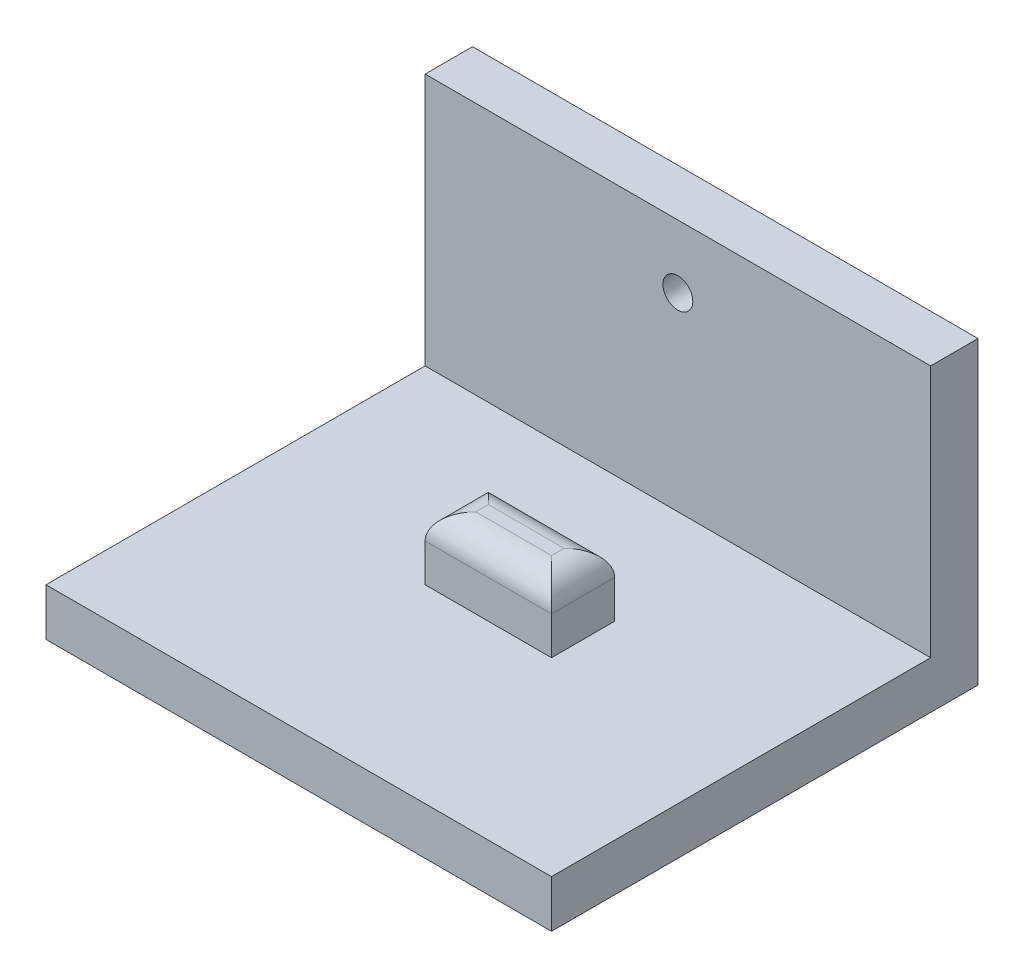
ISO-10303-21;
HEADER;
FILE_DESCRIPTION(('STEP AP214'),'2;1');
FILE_NAME('part.step','',(''),(''),'','','');
FILE_SCHEMA(('AUTOMOTIVE_DESIGN { 1 0 10303 214 1 1 1 1 }'));
ENDSEC;
DATA;
#1=APPLICATION_CONTEXT('core data for automotive mechanical design processes');
#2=APPLICATION_PROTOCOL_DEFINITION('international standard','automotive_design',2000,#1);
#3=PRODUCT_CONTEXT('',#1,'mechanical');
#4=PRODUCT('Part','Part','',(#3));
#5=PRODUCT_RELATED_PRODUCT_CATEGORY('part','',(#4));
#6=PRODUCT_DEFINITION_FORMATION('','',#4);
#7=PRODUCT_DEFINITION_CONTEXT('part definition',#1,'design');
#8=PRODUCT_DEFINITION('design','',#6,#7);
#9=PRODUCT_DEFINITION_SHAPE('','',#8);
#10=(LENGTH_UNIT() NAMED_UNIT(*) SI_UNIT(.MILLI.,.METRE.));
#11=(NAMED_UNIT(*) PLANE_ANGLE_UNIT() SI_UNIT($,.RADIAN.));
#12=(NAMED_UNIT(*) SI_UNIT($,.STERADIAN.) SOLID_ANGLE_UNIT());
#13=UNCERTAINTY_MEASURE_WITH_UNIT(LENGTH_MEASURE(1.E-05),#10,'distance_accuracy_value','');
#14=(GEOMETRIC_REPRESENTATION_CONTEXT(3) GLOBAL_UNCERTAINTY_ASSIGNED_CONTEXT((#13)) GLOBAL_UNIT_ASSIGNED_CONTEXT((#10,
#11,#12)) REPRESENTATION_CONTEXT('',''));
#15=CARTESIAN_POINT('',(0.,0.,0.));
#16=DIRECTION('',(0.,0.,1.));
#17=DIRECTION('',(1.,0.,0.));
#18=AXIS2_PLACEMENT_3D('',#15,#16,#17);
#19=CARTESIAN_POINT('',(50.8,4.7625,42.8625));
#20=DIRECTION('',(0.,-1.,0.));
#21=DIRECTION('',(0.,0.,-1.));
#22=AXIS2_PLACEMENT_3D('',#19,#20,#21);
#23=PLANE('',#22);
#24=DIRECTION('',(0.,0.,1.));
#25=VECTOR('',#24,1.);
#26=CARTESIAN_POINT('',(0.,4.7625,42.8625));
#27=LINE('',#26,#25);
#28=CARTESIAN_POINT('',(0.,4.7625,4.7625));
#29=VERTEX_POINT('',#28);
#30=CARTESIAN_POINT('',(0.,4.7625,42.8625));
#31=VERTEX_POINT('',#30);
#32=EDGE_CURVE('E200',#29,#31,#27,.T.);
#33=ORIENTED_EDGE('',*,*,#32,.T.);
#34=DIRECTION('',(-1.,0.,0.));
#35=VECTOR('',#34,1.);
#36=CARTESIAN_POINT('',(50.8,4.7625,42.8625));
#37=LINE('',#36,#35);
#38=CARTESIAN_POINT('',(50.8,4.7625,42.8625));
#39=VERTEX_POINT('',#38);
#40=EDGE_CURVE('E215',#39,#31,#37,.T.);
#41=ORIENTED_EDGE('',*,*,#40,.F.);
#42=DIRECTION('',(0.,0.,1.));
#43=VECTOR('',#42,1.);
#44=CARTESIAN_POINT('',(50.8,4.7625,42.8625));
#45=LINE('',#44,#43);
#46=CARTESIAN_POINT('',(50.8,4.7625,4.7625));
#47=VERTEX_POINT('',#46);
#48=EDGE_CURVE('E181',#47,#39,#45,.T.);
#49=ORIENTED_EDGE('',*,*,#48,.F.);
#50=DIRECTION('',(-1.,0.,0.));
#51=VECTOR('',#50,1.);
#52=CARTESIAN_POINT('',(50.8,4.7625,4.7625));
#53=LINE('',#52,#51);
#54=EDGE_CURVE('E219',#47,#29,#53,.T.);
#55=ORIENTED_EDGE('',*,*,#54,.T.);
#56=EDGE_LOOP('',(#33,#41,#49,#55));
#57=FACE_BOUND('',#56,.T.);
#58=DIRECTION('',(0.,0.,1.));
#59=VECTOR('',#58,1.);
#60=CARTESIAN_POINT('',(19.05,4.7625,23.8125));
#61=LINE('',#60,#59);
#62=CARTESIAN_POINT('',(19.05,4.7625,17.4625));
#63=VERTEX_POINT('',#62);
#64=CARTESIAN_POINT('',(19.05,4.7625,23.8125));
#65=VERTEX_POINT('',#64);
#66=EDGE_CURVE('E133',#63,#65,#61,.T.);
#67=ORIENTED_EDGE('',*,*,#66,.F.);
#68=DIRECTION('',(-1.,0.,0.));
#69=VECTOR('',#68,1.);
#70=CARTESIAN_POINT('',(19.05,4.7625,17.4625));
#71=LINE('',#70,#69);
#72=CARTESIAN_POINT('',(31.75,4.7625,17.4625));
#73=VERTEX_POINT('',#72);
#74=EDGE_CURVE('E141',#73,#63,#71,.T.);
#75=ORIENTED_EDGE('',*,*,#74,.F.);
#76=DIRECTION('',(0.,0.,-1.));
#77=VECTOR('',#76,1.);
#78=CARTESIAN_POINT('',(31.75,4.7625,23.8125));
#79=LINE('',#78,#77);
#80=CARTESIAN_POINT('',(31.75,4.7625,23.8125));
#81=VERTEX_POINT('',#80);
#82=EDGE_CURVE('E155',#81,#73,#79,.T.);
#83=ORIENTED_EDGE('',*,*,#82,.F.);
#84=DIRECTION('',(1.,0.,0.));
#85=VECTOR('',#84,1.);
#86=CARTESIAN_POINT('',(19.05,4.7625,23.8125));
#87=LINE('',#86,#85);
#88=EDGE_CURVE('E149',#65,#81,#87,.T.);
#89=ORIENTED_EDGE('',*,*,#88,.F.);
#90=EDGE_LOOP('',(#67,#75,#83,#89));
#91=FACE_BOUND('',#90,.T.);
#92=ADVANCED_FACE('F39',(#57,#91),#23,.F.);
#93=CARTESIAN_POINT('',(50.8,30.1625,0.));
#94=DIRECTION('',(0.,0.,1.));
#95=DIRECTION('',(0.,-1.,0.));
#96=AXIS2_PLACEMENT_3D('',#93,#94,#95);
#97=PLANE('',#96);
#98=CARTESIAN_POINT('',(25.4,23.8125,0.));
#99=DIRECTION('',(0.,0.,1.));
#100=DIRECTION('',(1.,0.,0.));
#101=AXIS2_PLACEMENT_3D('',#98,#99,#100);
#102=CIRCLE('',#101,1.499997);
#103=CARTESIAN_POINT('',(26.899997,23.8125,0.));
#104=VERTEX_POINT('',#103);
#105=EDGE_CURVE('E151',#104,#104,#102,.T.);
#106=ORIENTED_EDGE('',*,*,#105,.T.);
#107=EDGE_LOOP('',(#106));
#108=FACE_BOUND('',#107,.T.);
#109=DIRECTION('',(0.,1.,0.));
#110=VECTOR('',#109,1.);
#111=CARTESIAN_POINT('',(0.,30.1625,0.));
#112=LINE('',#111,#110);
#113=CARTESIAN_POINT('',(0.,0.,0.));
#114=VERTEX_POINT('',#113);
#115=CARTESIAN_POINT('',(0.,30.1625,0.));
#116=VERTEX_POINT('',#115);
#117=EDGE_CURVE('E169',#114,#116,#112,.T.);
#118=ORIENTED_EDGE('',*,*,#117,.T.);
#119=DIRECTION('',(-1.,0.,0.));
#120=VECTOR('',#119,1.);
#121=CARTESIAN_POINT('',(50.8,30.1625,0.));
#122=LINE('',#121,#120);
#123=CARTESIAN_POINT('',(50.8,30.1625,0.));
#124=VERTEX_POINT('',#123);
#125=EDGE_CURVE('E227',#124,#116,#122,.T.);
#126=ORIENTED_EDGE('',*,*,#125,.F.);
#127=DIRECTION('',(0.,1.,0.));
#128=VECTOR('',#127,1.);
#129=CARTESIAN_POINT('',(50.8,30.1625,0.));
#130=LINE('',#129,#128);
#131=CARTESIAN_POINT('',(50.8,0.,0.));
#132=VERTEX_POINT('',#131);
#133=EDGE_CURVE('E170',#132,#124,#130,.T.);
#134=ORIENTED_EDGE('',*,*,#133,.F.);
#135=DIRECTION('',(-1.,0.,0.));
#136=VECTOR('',#135,1.);
#137=CARTESIAN_POINT('',(50.8,0.,0.));
#138=LINE('',#137,#136);
#139=EDGE_CURVE('E190',#132,#114,#138,.T.);
#140=ORIENTED_EDGE('',*,*,#139,.T.);
#141=EDGE_LOOP('',(#118,#126,#134,#140));
#142=FACE_BOUND('',#141,.T.);
#143=ADVANCED_FACE('F297',(#108,#142),#97,.F.);
#144=CARTESIAN_POINT('',(50.8,30.1625,4.7625));
#145=DIRECTION('',(0.,-1.,0.));
#146=DIRECTION('',(0.,0.,-1.));
#147=AXIS2_PLACEMENT_3D('',#144,#145,#146);
#148=PLANE('',#147);
#149=DIRECTION('',(0.,0.,1.));
#150=VECTOR('',#149,1.);
#151=CARTESIAN_POINT('',(0.,30.1625,4.7625));
#152=LINE('',#151,#150);
#153=CARTESIAN_POINT('',(0.,30.1625,4.7625));
#154=VERTEX_POINT('',#153);
#155=EDGE_CURVE('E194',#116,#154,#152,.T.);
#156=ORIENTED_EDGE('',*,*,#155,.T.);
#157=DIRECTION('',(-1.,0.,0.));
#158=VECTOR('',#157,1.);
#159=CARTESIAN_POINT('',(50.8,30.1625,4.7625));
#160=LINE('',#159,#158);
#161=CARTESIAN_POINT('',(50.8,30.1625,4.7625));
#162=VERTEX_POINT('',#161);
#163=EDGE_CURVE('E223',#162,#154,#160,.T.);
#164=ORIENTED_EDGE('',*,*,#163,.F.);
#165=DIRECTION('',(0.,0.,1.));
#166=VECTOR('',#165,1.);
#167=CARTESIAN_POINT('',(50.8,30.1625,4.7625));
#168=LINE('',#167,#166);
#169=EDGE_CURVE('E174',#124,#162,#168,.T.);
#170=ORIENTED_EDGE('',*,*,#169,.F.);
#171=ORIENTED_EDGE('',*,*,#125,.T.);
#172=EDGE_LOOP('',(#156,#164,#170,#171));
#173=FACE_BOUND('',#172,.T.);
#174=ADVANCED_FACE('F303',(#173),#148,.F.);
#175=CARTESIAN_POINT('',(50.8,4.7625,4.7625));
#176=DIRECTION('',(0.,0.,-1.));
#177=DIRECTION('',(0.,1.,0.));
#178=AXIS2_PLACEMENT_3D('',#175,#176,#177);
#179=PLANE('',#178);
#180=CARTESIAN_POINT('',(25.4,23.8125,4.7625));
#181=DIRECTION('',(0.,0.,1.));
#182=DIRECTION('',(1.,0.,0.));
#183=AXIS2_PLACEMENT_3D('',#180,#181,#182);
#184=CIRCLE('',#183,1.499997);
#185=CARTESIAN_POINT('',(26.899997,23.8125,4.7625));
#186=VERTEX_POINT('',#185);
#187=EDGE_CURVE('E264',#186,#186,#184,.T.);
#188=ORIENTED_EDGE('',*,*,#187,.F.);
#189=EDGE_LOOP('',(#188));
#190=FACE_BOUND('',#189,.T.);
#191=DIRECTION('',(0.,-1.,0.));
#192=VECTOR('',#191,1.);
#193=CARTESIAN_POINT('',(0.,4.7625,4.7625));
#194=LINE('',#193,#192);
#195=EDGE_CURVE('E197',#154,#29,#194,.T.);
#196=ORIENTED_EDGE('',*,*,#195,.T.);
#197=ORIENTED_EDGE('',*,*,#54,.F.);
#198=DIRECTION('',(0.,-1.,0.));
#199=VECTOR('',#198,1.);
#200=CARTESIAN_POINT('',(50.8,4.7625,4.7625));
#201=LINE('',#200,#199);
#202=EDGE_CURVE('E178',#162,#47,#201,.T.);
#203=ORIENTED_EDGE('',*,*,#202,.F.);
#204=ORIENTED_EDGE('',*,*,#163,.T.);
#205=EDGE_LOOP('',(#196,#197,#203,#204));
#206=FACE_BOUND('',#205,.T.);
#207=ADVANCED_FACE('F310',(#190,#206),#179,.F.);
#208=CARTESIAN_POINT('',(50.8,0.,42.8625));
#209=DIRECTION('',(0.,0.,-1.));
#210=DIRECTION('',(-1.,0.,0.));
#211=AXIS2_PLACEMENT_3D('',#208,#209,#210);
#212=PLANE('',#211);
#213=DIRECTION('',(0.,-1.,0.));
#214=VECTOR('',#213,1.);
#215=CARTESIAN_POINT('',(0.,0.,42.8625));
#216=LINE('',#215,#214);
#217=CARTESIAN_POINT('',(0.,0.,42.8625));
#218=VERTEX_POINT('',#217);
#219=EDGE_CURVE('E203',#31,#218,#216,.T.);
#220=ORIENTED_EDGE('',*,*,#219,.T.);
#221=DIRECTION('',(-1.,0.,0.));
#222=VECTOR('',#221,1.);
#223=CARTESIAN_POINT('',(50.8,0.,42.8625));
#224=LINE('',#223,#222);
#225=CARTESIAN_POINT('',(50.8,0.,42.8625));
#226=VERTEX_POINT('',#225);
#227=EDGE_CURVE('E211',#226,#218,#224,.T.);
#228=ORIENTED_EDGE('',*,*,#227,.F.);
#229=DIRECTION('',(0.,-1.,0.));
#230=VECTOR('',#229,1.);
#231=CARTESIAN_POINT('',(50.8,0.,42.8625));
#232=LINE('',#231,#230);
#233=EDGE_CURVE('E184',#39,#226,#232,.T.);
#234=ORIENTED_EDGE('',*,*,#233,.F.);
#235=ORIENTED_EDGE('',*,*,#40,.T.);
#236=EDGE_LOOP('',(#220,#228,#234,#235));
#237=FACE_BOUND('',#236,.T.);
#238=ADVANCED_FACE('F308',(#237),#212,.F.);
#239=CARTESIAN_POINT('',(50.8,0.,0.));
#240=DIRECTION('',(0.,1.,0.));
#241=DIRECTION('',(0.,0.,1.));
#242=AXIS2_PLACEMENT_3D('',#239,#240,#241);
#243=PLANE('',#242);
#244=DIRECTION('',(0.,0.,-1.));
#245=VECTOR('',#244,1.);
#246=CARTESIAN_POINT('',(0.,0.,0.));
#247=LINE('',#246,#245);
#248=EDGE_CURVE('E175',#218,#114,#247,.T.);
#249=ORIENTED_EDGE('',*,*,#248,.T.);
#250=ORIENTED_EDGE('',*,*,#139,.F.);
#251=DIRECTION('',(0.,0.,-1.));
#252=VECTOR('',#251,1.);
#253=CARTESIAN_POINT('',(50.8,0.,0.));
#254=LINE('',#253,#252);
#255=EDGE_CURVE('E187',#226,#132,#254,.T.);
#256=ORIENTED_EDGE('',*,*,#255,.F.);
#257=ORIENTED_EDGE('',*,*,#227,.T.);
#258=EDGE_LOOP('',(#249,#250,#256,#257));
#259=FACE_BOUND('',#258,.T.);
#260=ADVANCED_FACE('F356',(#259),#243,.F.);
#261=CARTESIAN_POINT('',(50.8,0.,0.));
#262=DIRECTION('',(-1.,0.,0.));
#263=DIRECTION('',(0.,0.,1.));
#264=AXIS2_PLACEMENT_3D('',#261,#262,#263);
#265=PLANE('',#264);
#266=ORIENTED_EDGE('',*,*,#133,.T.);
#267=ORIENTED_EDGE('',*,*,#169,.T.);
#268=ORIENTED_EDGE('',*,*,#202,.T.);
#269=ORIENTED_EDGE('',*,*,#48,.T.);
#270=ORIENTED_EDGE('',*,*,#233,.T.);
#271=ORIENTED_EDGE('',*,*,#255,.T.);
#272=EDGE_LOOP('',(#266,#267,#268,#269,#270,#271));
#273=FACE_BOUND('',#272,.T.);
#274=ADVANCED_FACE('F351',(#273),#265,.F.);
#275=CARTESIAN_POINT('',(0.,0.,0.));
#276=DIRECTION('',(-1.,0.,0.));
#277=DIRECTION('',(0.,0.,1.));
#278=AXIS2_PLACEMENT_3D('',#275,#276,#277);
#279=PLANE('',#278);
#280=ORIENTED_EDGE('',*,*,#117,.F.);
#281=ORIENTED_EDGE('',*,*,#248,.F.);
#282=ORIENTED_EDGE('',*,*,#219,.F.);
#283=ORIENTED_EDGE('',*,*,#32,.F.);
#284=ORIENTED_EDGE('',*,*,#195,.F.);
#285=ORIENTED_EDGE('',*,*,#155,.F.);
#286=EDGE_LOOP('',(#280,#281,#282,#283,#284,#285));
#287=FACE_BOUND('',#286,.T.);
#288=ADVANCED_FACE('F344',(#287),#279,.T.);
#289=CARTESIAN_POINT('',(19.05,11.1125,23.8125));
#290=DIRECTION('',(1.,0.,0.));
#291=DIRECTION('',(0.,0.,-1.));
#292=AXIS2_PLACEMENT_3D('',#289,#290,#291);
#293=PLANE('',#292);
#294=DIRECTION('',(0.,-1.,0.));
#295=VECTOR('',#294,1.);
#296=CARTESIAN_POINT('',(19.05,11.1125,23.8125));
#297=LINE('',#296,#295);
#298=CARTESIAN_POINT('',(19.05,8.5725,23.8125));
#299=VERTEX_POINT('',#298);
#300=EDGE_CURVE('E166',#299,#65,#297,.T.);
#301=ORIENTED_EDGE('',*,*,#300,.F.);
#302=DIRECTION('',(0.,0.,1.));
#303=VECTOR('',#302,1.);
#304=CARTESIAN_POINT('',(19.05,8.5725,23.8125));
#305=LINE('',#304,#303);
#306=CARTESIAN_POINT('',(19.05,8.5725,17.4625));
#307=VERTEX_POINT('',#306);
#308=EDGE_CURVE('E11',#299,#307,#305,.F.);
#309=ORIENTED_EDGE('',*,*,#308,.T.);
#310=DIRECTION('',(0.,-1.,0.));
#311=VECTOR('',#310,1.);
#312=CARTESIAN_POINT('',(19.05,11.1125,17.4625));
#313=LINE('',#312,#311);
#314=EDGE_CURVE('E130',#307,#63,#313,.T.);
#315=ORIENTED_EDGE('',*,*,#314,.T.);
#316=ORIENTED_EDGE('',*,*,#66,.T.);
#317=EDGE_LOOP('',(#301,#309,#315,#316));
#318=FACE_BOUND('',#317,.T.);
#319=ADVANCED_FACE('F132',(#318),#293,.F.);
#320=CARTESIAN_POINT('',(19.05,11.1125,23.8125));
#321=DIRECTION('',(0.,0.,-1.));
#322=DIRECTION('',(0.,1.,0.));
#323=AXIS2_PLACEMENT_3D('',#320,#321,#322);
#324=PLANE('',#323);
#325=DIRECTION('',(0.,-1.,0.));
#326=VECTOR('',#325,1.);
#327=CARTESIAN_POINT('',(31.75,11.1125,23.8125));
#328=LINE('',#327,#326);
#329=CARTESIAN_POINT('',(31.75,8.5725,23.8125));
#330=VERTEX_POINT('',#329);
#331=EDGE_CURVE('E163',#330,#81,#328,.T.);
#332=ORIENTED_EDGE('',*,*,#331,.F.);
#333=DIRECTION('',(1.,0.,0.));
#334=VECTOR('',#333,1.);
#335=CARTESIAN_POINT('',(19.05,8.5725,23.8125));
#336=LINE('',#335,#334);
#337=EDGE_CURVE('E49',#330,#299,#336,.F.);
#338=ORIENTED_EDGE('',*,*,#337,.T.);
#339=ORIENTED_EDGE('',*,*,#300,.T.);
#340=ORIENTED_EDGE('',*,*,#88,.T.);
#341=EDGE_LOOP('',(#332,#338,#339,#340));
#342=FACE_BOUND('',#341,.T.);
#343=ADVANCED_FACE('F277',(#342),#324,.F.);
#344=CARTESIAN_POINT('',(31.75,11.1125,23.8125));
#345=DIRECTION('',(-1.,0.,0.));
#346=DIRECTION('',(0.,0.,1.));
#347=AXIS2_PLACEMENT_3D('',#344,#345,#346);
#348=PLANE('',#347);
#349=DIRECTION('',(0.,-1.,0.));
#350=VECTOR('',#349,1.);
#351=CARTESIAN_POINT('',(31.75,11.1125,17.4625));
#352=LINE('',#351,#350);
#353=CARTESIAN_POINT('',(31.75,8.5725,17.4625));
#354=VERTEX_POINT('',#353);
#355=EDGE_CURVE('E140',#354,#73,#352,.T.);
#356=ORIENTED_EDGE('',*,*,#355,.F.);
#357=DIRECTION('',(0.,0.,-1.));
#358=VECTOR('',#357,1.);
#359=CARTESIAN_POINT('',(31.75,8.5725,23.8125));
#360=LINE('',#359,#358);
#361=EDGE_CURVE('E64',#354,#330,#360,.F.);
#362=ORIENTED_EDGE('',*,*,#361,.T.);
#363=ORIENTED_EDGE('',*,*,#331,.T.);
#364=ORIENTED_EDGE('',*,*,#82,.T.);
#365=EDGE_LOOP('',(#356,#362,#363,#364));
#366=FACE_BOUND('',#365,.T.);
#367=ADVANCED_FACE('F286',(#366),#348,.F.);
#368=CARTESIAN_POINT('',(19.05,11.1125,17.4625));
#369=DIRECTION('',(0.,0.,1.));
#370=DIRECTION('',(0.,-1.,0.));
#371=AXIS2_PLACEMENT_3D('',#368,#369,#370);
#372=PLANE('',#371);
#373=ORIENTED_EDGE('',*,*,#314,.F.);
#374=DIRECTION('',(-1.,0.,0.));
#375=VECTOR('',#374,1.);
#376=CARTESIAN_POINT('',(19.05,8.5725,17.4625));
#377=LINE('',#376,#375);
#378=EDGE_CURVE('E244',#307,#354,#377,.F.);
#379=ORIENTED_EDGE('',*,*,#378,.T.);
#380=ORIENTED_EDGE('',*,*,#355,.T.);
#381=ORIENTED_EDGE('',*,*,#74,.T.);
#382=EDGE_LOOP('',(#373,#379,#380,#381));
#383=FACE_BOUND('',#382,.T.);
#384=ADVANCED_FACE('F153',(#383),#372,.F.);
#385=CARTESIAN_POINT('',(0.,11.1125,0.));
#386=DIRECTION('',(0.,-1.,0.));
#387=DIRECTION('',(0.,0.,-1.));
#388=AXIS2_PLACEMENT_3D('',#385,#386,#387);
#389=PLANE('',#388);
#390=DIRECTION('',(0.,0.,-1.));
#391=VECTOR('',#390,1.);
#392=CARTESIAN_POINT('',(29.21,11.1125,0.));
#393=LINE('',#392,#391);
#394=CARTESIAN_POINT('',(29.21,11.1125,21.2725));
#395=VERTEX_POINT('',#394);
#396=CARTESIAN_POINT('',(29.21,11.1125,20.0025));
#397=VERTEX_POINT('',#396);
#398=EDGE_CURVE('E237',#395,#397,#393,.T.);
#399=ORIENTED_EDGE('',*,*,#398,.T.);
#400=DIRECTION('',(-1.,0.,0.));
#401=VECTOR('',#400,1.);
#402=CARTESIAN_POINT('',(0.,11.1125,20.0025));
#403=LINE('',#402,#401);
#404=CARTESIAN_POINT('',(21.59,11.1125,20.0025));
#405=VERTEX_POINT('',#404);
#406=EDGE_CURVE('E240',#397,#405,#403,.T.);
#407=ORIENTED_EDGE('',*,*,#406,.T.);
#408=DIRECTION('',(0.,0.,1.));
#409=VECTOR('',#408,1.);
#410=CARTESIAN_POINT('',(21.59,11.1125,0.));
#411=LINE('',#410,#409);
#412=CARTESIAN_POINT('',(21.59,11.1125,21.2725));
#413=VERTEX_POINT('',#412);
#414=EDGE_CURVE('E231',#405,#413,#411,.T.);
#415=ORIENTED_EDGE('',*,*,#414,.T.);
#416=DIRECTION('',(1.,0.,0.));
#417=VECTOR('',#416,1.);
#418=CARTESIAN_POINT('',(0.,11.1125,21.2725));
#419=LINE('',#418,#417);
#420=EDGE_CURVE('E234',#413,#395,#419,.T.);
#421=ORIENTED_EDGE('',*,*,#420,.T.);
#422=EDGE_LOOP('',(#399,#407,#415,#421));
#423=FACE_BOUND('',#422,.T.);
#424=ADVANCED_FACE('F293',(#423),#389,.F.);
#425=CARTESIAN_POINT('',(25.4,23.8125,0.));
#426=DIRECTION('',(0.,0.,1.));
#427=DIRECTION('',(1.,0.,0.));
#428=AXIS2_PLACEMENT_3D('',#425,#426,#427);
#429=CYLINDRICAL_SURFACE('',#428,1.499997);
#430=ORIENTED_EDGE('',*,*,#105,.F.);
#431=EDGE_LOOP('',(#430));
#432=FACE_BOUND('',#431,.T.);
#433=ORIENTED_EDGE('',*,*,#187,.T.);
#434=EDGE_LOOP('',(#433));
#435=FACE_BOUND('',#434,.T.);
#436=ADVANCED_FACE('F325',(#432,#435),#429,.F.);
#437=CARTESIAN_POINT('',(0.,8.5725,21.2725));
#438=DIRECTION('',(1.,0.,0.));
#439=DIRECTION('',(0.,0.,-1.));
#440=AXIS2_PLACEMENT_3D('',#437,#438,#439);
#441=CYLINDRICAL_SURFACE('',#440,2.54);
#442=CARTESIAN_POINT('',(21.59,8.5725,21.2725));
#443=DIRECTION('',(0.707106781186547,0.,0.707106781186547));
#444=DIRECTION('',(-0.707106781186547,0.,0.707106781186547));
#445=AXIS2_PLACEMENT_3D('',#442,#443,#444);
#446=ELLIPSE('',#445,3.59210244842766,2.54);
#447=EDGE_CURVE('E256',#299,#413,#446,.F.);
#448=ORIENTED_EDGE('',*,*,#447,.F.);
#449=ORIENTED_EDGE('',*,*,#337,.F.);
#450=CARTESIAN_POINT('',(29.21,8.5725,21.2725));
#451=DIRECTION('',(0.707106781186547,0.,-0.707106781186547));
#452=DIRECTION('',(0.707106781186547,0.,0.707106781186547));
#453=AXIS2_PLACEMENT_3D('',#450,#451,#452);
#454=ELLIPSE('',#453,3.59210244842766,2.54);
#455=EDGE_CURVE('E43',#395,#330,#454,.T.);
#456=ORIENTED_EDGE('',*,*,#455,.F.);
#457=ORIENTED_EDGE('',*,*,#420,.F.);
#458=EDGE_LOOP('',(#448,#449,#456,#457));
#459=FACE_BOUND('',#458,.T.);
#460=ADVANCED_FACE('F41',(#459),#441,.T.);
#461=CARTESIAN_POINT('',(29.21,8.5725,0.));
#462=DIRECTION('',(0.,0.,-1.));
#463=DIRECTION('',(-1.,0.,0.));
#464=AXIS2_PLACEMENT_3D('',#461,#462,#463);
#465=CYLINDRICAL_SURFACE('',#464,2.54);
#466=ORIENTED_EDGE('',*,*,#455,.T.);
#467=ORIENTED_EDGE('',*,*,#361,.F.);
#468=CARTESIAN_POINT('',(29.21,8.5725,20.0025));
#469=DIRECTION('',(-0.707106781186547,0.,-0.707106781186547));
#470=DIRECTION('',(0.707106781186547,0.,-0.707106781186547));
#471=AXIS2_PLACEMENT_3D('',#468,#469,#470);
#472=ELLIPSE('',#471,3.59210244842766,2.54);
#473=EDGE_CURVE('E254',#397,#354,#472,.T.);
#474=ORIENTED_EDGE('',*,*,#473,.F.);
#475=ORIENTED_EDGE('',*,*,#398,.F.);
#476=EDGE_LOOP('',(#466,#467,#474,#475));
#477=FACE_BOUND('',#476,.T.);
#478=ADVANCED_FACE('F320',(#477),#465,.T.);
#479=CARTESIAN_POINT('',(21.59,8.5725,0.));
#480=DIRECTION('',(0.,0.,1.));
#481=DIRECTION('',(1.,0.,0.));
#482=AXIS2_PLACEMENT_3D('',#479,#480,#481);
#483=CYLINDRICAL_SURFACE('',#482,2.54);
#484=ORIENTED_EDGE('',*,*,#447,.T.);
#485=ORIENTED_EDGE('',*,*,#414,.F.);
#486=CARTESIAN_POINT('',(21.59,8.5725,20.0025));
#487=DIRECTION('',(-0.707106781186547,0.,0.707106781186547));
#488=DIRECTION('',(0.707106781186547,0.,0.707106781186547));
#489=AXIS2_PLACEMENT_3D('',#486,#487,#488);
#490=ELLIPSE('',#489,3.59210244842766,2.54);
#491=EDGE_CURVE('E251',#307,#405,#490,.F.);
#492=ORIENTED_EDGE('',*,*,#491,.F.);
#493=ORIENTED_EDGE('',*,*,#308,.F.);
#494=EDGE_LOOP('',(#484,#485,#492,#493));
#495=FACE_BOUND('',#494,.T.);
#496=ADVANCED_FACE('F281',(#495),#483,.T.);
#497=CARTESIAN_POINT('',(0.,8.5725,20.0025));
#498=DIRECTION('',(-1.,0.,0.));
#499=DIRECTION('',(0.,0.,1.));
#500=AXIS2_PLACEMENT_3D('',#497,#498,#499);
#501=CYLINDRICAL_SURFACE('',#500,2.54);
#502=ORIENTED_EDGE('',*,*,#473,.T.);
#503=ORIENTED_EDGE('',*,*,#378,.F.);
#504=ORIENTED_EDGE('',*,*,#491,.T.);
#505=ORIENTED_EDGE('',*,*,#406,.F.);
#506=EDGE_LOOP('',(#502,#503,#504,#505));
#507=FACE_BOUND('',#506,.T.);
#508=ADVANCED_FACE('F284',(#507),#501,.T.);
#509=CLOSED_SHELL('',(#92,#143,#174,#207,#238,#260,#274,#288,#319,#343,#367,#384,#424,#436,#460,
#478,#496,#508));
#510=MANIFOLD_SOLID_BREP('B2',#509);
#511=ADVANCED_BREP_SHAPE_REPRESENTATION('',(#18,#510),#14);
#512=SHAPE_DEFINITION_REPRESENTATION(#9,#511);
ENDSEC;
END-ISO-10303-21;
